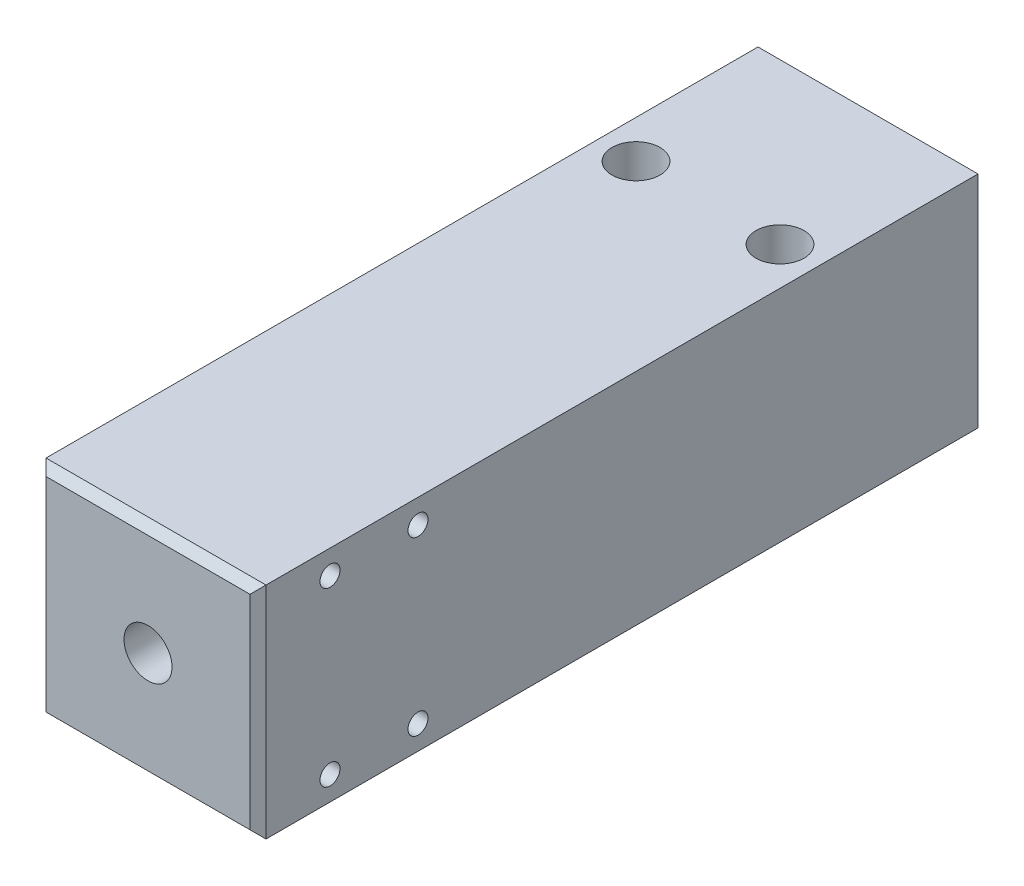
ISO-10303-21;
HEADER;
FILE_DESCRIPTION(('STEP AP214'),'2;1');
FILE_NAME('part.step','',(''),(''),'','','');
FILE_SCHEMA(('AUTOMOTIVE_DESIGN { 1 0 10303 214 1 1 1 1 }'));
ENDSEC;
DATA;
#1=APPLICATION_CONTEXT('core data for automotive mechanical design processes');
#2=APPLICATION_PROTOCOL_DEFINITION('international standard','automotive_design',2000,#1);
#3=PRODUCT_CONTEXT('',#1,'mechanical');
#4=PRODUCT('Part','Part','',(#3));
#5=PRODUCT_RELATED_PRODUCT_CATEGORY('part','',(#4));
#6=PRODUCT_DEFINITION_FORMATION('','',#4);
#7=PRODUCT_DEFINITION_CONTEXT('part definition',#1,'design');
#8=PRODUCT_DEFINITION('design','',#6,#7);
#9=PRODUCT_DEFINITION_SHAPE('','',#8);
#10=(LENGTH_UNIT() NAMED_UNIT(*) SI_UNIT(.MILLI.,.METRE.));
#11=(NAMED_UNIT(*) PLANE_ANGLE_UNIT() SI_UNIT($,.RADIAN.));
#12=(NAMED_UNIT(*) SI_UNIT($,.STERADIAN.) SOLID_ANGLE_UNIT());
#13=UNCERTAINTY_MEASURE_WITH_UNIT(LENGTH_MEASURE(1.E-05),#10,'distance_accuracy_value','');
#14=(GEOMETRIC_REPRESENTATION_CONTEXT(3) GLOBAL_UNCERTAINTY_ASSIGNED_CONTEXT((#13)) GLOBAL_UNIT_ASSIGNED_CONTEXT((#10,
#11,#12)) REPRESENTATION_CONTEXT('',''));
#15=CARTESIAN_POINT('',(0.,0.,0.));
#16=DIRECTION('',(0.,0.,1.));
#17=DIRECTION('',(1.,0.,0.));
#18=AXIS2_PLACEMENT_3D('',#15,#16,#17);
#19=CARTESIAN_POINT('',(27.5,27.5,-180.));
#20=DIRECTION('',(1.,0.,0.));
#21=DIRECTION('',(0.,1.,0.));
#22=AXIS2_PLACEMENT_3D('',#19,#20,#21);
#23=PLANE('',#22);
#24=CARTESIAN_POINT('',(27.5,-21.5,-18.));
#25=DIRECTION('',(1.,0.,0.));
#26=DIRECTION('',(0.,1.,0.));
#27=AXIS2_PLACEMENT_3D('',#24,#25,#26);
#28=CIRCLE('',#27,2.5);
#29=CARTESIAN_POINT('',(27.5,-19.,-18.));
#30=VERTEX_POINT('',#29);
#31=EDGE_CURVE('E187',#30,#30,#28,.T.);
#32=ORIENTED_EDGE('',*,*,#31,.F.);
#33=EDGE_LOOP('',(#32));
#34=FACE_BOUND('',#33,.T.);
#35=CARTESIAN_POINT('',(27.5,-21.5,-40.));
#36=DIRECTION('',(1.,0.,0.));
#37=DIRECTION('',(0.,1.,0.));
#38=AXIS2_PLACEMENT_3D('',#35,#36,#37);
#39=CIRCLE('',#38,2.5);
#40=CARTESIAN_POINT('',(27.5,-19.,-40.));
#41=VERTEX_POINT('',#40);
#42=EDGE_CURVE('E193',#41,#41,#39,.T.);
#43=ORIENTED_EDGE('',*,*,#42,.F.);
#44=EDGE_LOOP('',(#43));
#45=FACE_BOUND('',#44,.T.);
#46=CARTESIAN_POINT('',(27.5,21.5,-40.));
#47=DIRECTION('',(1.,0.,0.));
#48=DIRECTION('',(0.,1.,0.));
#49=AXIS2_PLACEMENT_3D('',#46,#47,#48);
#50=CIRCLE('',#49,2.5);
#51=CARTESIAN_POINT('',(27.5,24.,-40.));
#52=VERTEX_POINT('',#51);
#53=EDGE_CURVE('E199',#52,#52,#50,.T.);
#54=ORIENTED_EDGE('',*,*,#53,.F.);
#55=EDGE_LOOP('',(#54));
#56=FACE_BOUND('',#55,.T.);
#57=CARTESIAN_POINT('',(27.5,21.5,-18.));
#58=DIRECTION('',(1.,0.,0.));
#59=DIRECTION('',(0.,1.,0.));
#60=AXIS2_PLACEMENT_3D('',#57,#58,#59);
#61=CIRCLE('',#60,2.5);
#62=CARTESIAN_POINT('',(27.5,24.,-18.));
#63=VERTEX_POINT('',#62);
#64=EDGE_CURVE('E205',#63,#63,#61,.T.);
#65=ORIENTED_EDGE('',*,*,#64,.F.);
#66=EDGE_LOOP('',(#65));
#67=FACE_BOUND('',#66,.T.);
#68=DIRECTION('',(0.,0.,1.));
#69=VECTOR('',#68,1.);
#70=CARTESIAN_POINT('',(27.5,27.5,-180.));
#71=LINE('',#70,#69);
#72=CARTESIAN_POINT('',(27.5,27.5,-180.));
#73=VERTEX_POINT('',#72);
#74=CARTESIAN_POINT('',(27.5,27.5,-2.00000000000006));
#75=VERTEX_POINT('',#74);
#76=EDGE_CURVE('E89',#73,#75,#71,.T.);
#77=ORIENTED_EDGE('',*,*,#76,.T.);
#78=DIRECTION('',(0.,-1.,0.));
#79=VECTOR('',#78,1.);
#80=CARTESIAN_POINT('',(27.5,27.5,-2.));
#81=LINE('',#80,#79);
#82=CARTESIAN_POINT('',(27.5,-27.5,-2.00000000000006));
#83=VERTEX_POINT('',#82);
#84=EDGE_CURVE('E46',#75,#83,#81,.T.);
#85=ORIENTED_EDGE('',*,*,#84,.T.);
#86=DIRECTION('',(0.,0.,1.));
#87=VECTOR('',#86,1.);
#88=CARTESIAN_POINT('',(27.5,-27.5,-180.));
#89=LINE('',#88,#87);
#90=CARTESIAN_POINT('',(27.5,-27.5,-180.));
#91=VERTEX_POINT('',#90);
#92=EDGE_CURVE('E110',#91,#83,#89,.T.);
#93=ORIENTED_EDGE('',*,*,#92,.F.);
#94=DIRECTION('',(0.,1.,0.));
#95=VECTOR('',#94,1.);
#96=CARTESIAN_POINT('',(27.5,27.5,-180.));
#97=LINE('',#96,#95);
#98=EDGE_CURVE('E104',#91,#73,#97,.T.);
#99=ORIENTED_EDGE('',*,*,#98,.T.);
#100=EDGE_LOOP('',(#77,#85,#93,#99));
#101=FACE_BOUND('',#100,.T.);
#102=ADVANCED_FACE('F37',(#34,#45,#56,#67,#101),#23,.T.);
#103=CARTESIAN_POINT('',(-27.5,-27.5,-180.));
#104=DIRECTION('',(0.,-1.,0.));
#105=DIRECTION('',(0.,0.,-1.));
#106=AXIS2_PLACEMENT_3D('',#103,#104,#105);
#107=PLANE('',#106);
#108=ORIENTED_EDGE('',*,*,#92,.T.);
#109=DIRECTION('',(-1.,0.,0.));
#110=VECTOR('',#109,1.);
#111=CARTESIAN_POINT('',(-27.5,-27.5,-2.));
#112=LINE('',#111,#110);
#113=CARTESIAN_POINT('',(-27.5,-27.5,-2.00000000000006));
#114=VERTEX_POINT('',#113);
#115=EDGE_CURVE('E133',#83,#114,#112,.T.);
#116=ORIENTED_EDGE('',*,*,#115,.T.);
#117=DIRECTION('',(0.,0.,1.));
#118=VECTOR('',#117,1.);
#119=CARTESIAN_POINT('',(-27.5,-27.5,-180.));
#120=LINE('',#119,#118);
#121=CARTESIAN_POINT('',(-27.5,-27.5,-180.));
#122=VERTEX_POINT('',#121);
#123=EDGE_CURVE('E122',#122,#114,#120,.T.);
#124=ORIENTED_EDGE('',*,*,#123,.F.);
#125=DIRECTION('',(1.,0.,0.));
#126=VECTOR('',#125,1.);
#127=CARTESIAN_POINT('',(-27.5,-27.5,-180.));
#128=LINE('',#127,#126);
#129=EDGE_CURVE('E97',#122,#91,#128,.T.);
#130=ORIENTED_EDGE('',*,*,#129,.T.);
#131=EDGE_LOOP('',(#108,#116,#124,#130));
#132=FACE_BOUND('',#131,.T.);
#133=ADVANCED_FACE('F258',(#132),#107,.T.);
#134=CARTESIAN_POINT('',(-27.5,27.5,-180.));
#135=DIRECTION('',(-1.,0.,0.));
#136=DIRECTION('',(0.,-1.,0.));
#137=AXIS2_PLACEMENT_3D('',#134,#135,#136);
#138=PLANE('',#137);
#139=CARTESIAN_POINT('',(-27.5,-21.5,-18.));
#140=DIRECTION('',(-1.,0.,0.));
#141=DIRECTION('',(0.,-1.,0.));
#142=AXIS2_PLACEMENT_3D('',#139,#140,#141);
#143=CIRCLE('',#142,2.5);
#144=CARTESIAN_POINT('',(-27.5,-24.,-18.));
#145=VERTEX_POINT('',#144);
#146=EDGE_CURVE('E163',#145,#145,#143,.T.);
#147=ORIENTED_EDGE('',*,*,#146,.F.);
#148=EDGE_LOOP('',(#147));
#149=FACE_BOUND('',#148,.T.);
#150=CARTESIAN_POINT('',(-27.5,-21.5,-40.));
#151=DIRECTION('',(-1.,0.,0.));
#152=DIRECTION('',(0.,-1.,0.));
#153=AXIS2_PLACEMENT_3D('',#150,#151,#152);
#154=CIRCLE('',#153,2.5);
#155=CARTESIAN_POINT('',(-27.5,-24.,-40.));
#156=VERTEX_POINT('',#155);
#157=EDGE_CURVE('E169',#156,#156,#154,.T.);
#158=ORIENTED_EDGE('',*,*,#157,.F.);
#159=EDGE_LOOP('',(#158));
#160=FACE_BOUND('',#159,.T.);
#161=CARTESIAN_POINT('',(-27.5,21.5,-40.));
#162=DIRECTION('',(-1.,0.,0.));
#163=DIRECTION('',(0.,-1.,0.));
#164=AXIS2_PLACEMENT_3D('',#161,#162,#163);
#165=CIRCLE('',#164,2.5);
#166=CARTESIAN_POINT('',(-27.5,19.,-40.));
#167=VERTEX_POINT('',#166);
#168=EDGE_CURVE('E175',#167,#167,#165,.T.);
#169=ORIENTED_EDGE('',*,*,#168,.F.);
#170=EDGE_LOOP('',(#169));
#171=FACE_BOUND('',#170,.T.);
#172=CARTESIAN_POINT('',(-27.5,21.5,-18.));
#173=DIRECTION('',(-1.,0.,0.));
#174=DIRECTION('',(0.,-1.,0.));
#175=AXIS2_PLACEMENT_3D('',#172,#173,#174);
#176=CIRCLE('',#175,2.5);
#177=CARTESIAN_POINT('',(-27.5,19.,-18.));
#178=VERTEX_POINT('',#177);
#179=EDGE_CURVE('E181',#178,#178,#176,.T.);
#180=ORIENTED_EDGE('',*,*,#179,.F.);
#181=EDGE_LOOP('',(#180));
#182=FACE_BOUND('',#181,.T.);
#183=ORIENTED_EDGE('',*,*,#123,.T.);
#184=DIRECTION('',(0.,1.,0.));
#185=VECTOR('',#184,1.);
#186=CARTESIAN_POINT('',(-27.5,27.5,-2.));
#187=LINE('',#186,#185);
#188=CARTESIAN_POINT('',(-27.5,27.5,-2.00000000000006));
#189=VERTEX_POINT('',#188);
#190=EDGE_CURVE('E60',#114,#189,#187,.T.);
#191=ORIENTED_EDGE('',*,*,#190,.T.);
#192=DIRECTION('',(0.,0.,1.));
#193=VECTOR('',#192,1.);
#194=CARTESIAN_POINT('',(-27.5,27.5,-180.));
#195=LINE('',#194,#193);
#196=CARTESIAN_POINT('',(-27.5,27.5,-180.));
#197=VERTEX_POINT('',#196);
#198=EDGE_CURVE('E96',#197,#189,#195,.T.);
#199=ORIENTED_EDGE('',*,*,#198,.F.);
#200=DIRECTION('',(0.,-1.,0.));
#201=VECTOR('',#200,1.);
#202=CARTESIAN_POINT('',(-27.5,27.5,-180.));
#203=LINE('',#202,#201);
#204=EDGE_CURVE('E107',#197,#122,#203,.T.);
#205=ORIENTED_EDGE('',*,*,#204,.T.);
#206=EDGE_LOOP('',(#183,#191,#199,#205));
#207=FACE_BOUND('',#206,.T.);
#208=ADVANCED_FACE('F251',(#149,#160,#171,#182,#207),#138,.T.);
#209=CARTESIAN_POINT('',(-27.5,27.5,-180.));
#210=DIRECTION('',(0.,1.,0.));
#211=DIRECTION('',(0.,0.,1.));
#212=AXIS2_PLACEMENT_3D('',#209,#210,#211);
#213=PLANE('',#212);
#214=CARTESIAN_POINT('',(18.,27.5,-140.));
#215=DIRECTION('',(0.,1.,0.));
#216=DIRECTION('',(0.,0.,1.));
#217=AXIS2_PLACEMENT_3D('',#214,#215,#216);
#218=CIRCLE('',#217,6.);
#219=CARTESIAN_POINT('',(18.,27.5,-134.));
#220=VERTEX_POINT('',#219);
#221=EDGE_CURVE('E147',#220,#220,#218,.T.);
#222=ORIENTED_EDGE('',*,*,#221,.F.);
#223=EDGE_LOOP('',(#222));
#224=FACE_BOUND('',#223,.T.);
#225=CARTESIAN_POINT('',(-18.,27.5,-140.));
#226=DIRECTION('',(0.,1.,0.));
#227=DIRECTION('',(0.,0.,1.));
#228=AXIS2_PLACEMENT_3D('',#225,#226,#227);
#229=CIRCLE('',#228,6.);
#230=CARTESIAN_POINT('',(-18.,27.5,-134.));
#231=VERTEX_POINT('',#230);
#232=EDGE_CURVE('E157',#231,#231,#229,.T.);
#233=ORIENTED_EDGE('',*,*,#232,.F.);
#234=EDGE_LOOP('',(#233));
#235=FACE_BOUND('',#234,.T.);
#236=ORIENTED_EDGE('',*,*,#198,.T.);
#237=DIRECTION('',(1.,0.,0.));
#238=VECTOR('',#237,1.);
#239=CARTESIAN_POINT('',(-27.5,27.5,-2.));
#240=LINE('',#239,#238);
#241=EDGE_CURVE('E11',#189,#75,#240,.T.);
#242=ORIENTED_EDGE('',*,*,#241,.T.);
#243=ORIENTED_EDGE('',*,*,#76,.F.);
#244=DIRECTION('',(-1.,0.,0.));
#245=VECTOR('',#244,1.);
#246=CARTESIAN_POINT('',(-27.5,27.5,-180.));
#247=LINE('',#246,#245);
#248=EDGE_CURVE('E92',#73,#197,#247,.T.);
#249=ORIENTED_EDGE('',*,*,#248,.T.);
#250=EDGE_LOOP('',(#236,#242,#243,#249));
#251=FACE_BOUND('',#250,.T.);
#252=ADVANCED_FACE('F91',(#224,#235,#251),#213,.T.);
#253=CARTESIAN_POINT('',(0.,0.,-180.));
#254=DIRECTION('',(0.,0.,1.));
#255=DIRECTION('',(1.,0.,0.));
#256=AXIS2_PLACEMENT_3D('',#253,#254,#255);
#257=PLANE('',#256);
#258=CARTESIAN_POINT('',(-18.,-18.,-180.));
#259=DIRECTION('',(0.,0.,-1.));
#260=DIRECTION('',(-1.,0.,0.));
#261=AXIS2_PLACEMENT_3D('',#258,#259,#260);
#262=CIRCLE('',#261,4.);
#263=CARTESIAN_POINT('',(-22.,-18.,-180.));
#264=VERTEX_POINT('',#263);
#265=EDGE_CURVE('E211',#264,#264,#262,.T.);
#266=ORIENTED_EDGE('',*,*,#265,.F.);
#267=EDGE_LOOP('',(#266));
#268=FACE_BOUND('',#267,.T.);
#269=CARTESIAN_POINT('',(18.,-18.,-180.));
#270=DIRECTION('',(0.,0.,-1.));
#271=DIRECTION('',(-1.,0.,0.));
#272=AXIS2_PLACEMENT_3D('',#269,#270,#271);
#273=CIRCLE('',#272,4.);
#274=CARTESIAN_POINT('',(14.,-18.,-180.));
#275=VERTEX_POINT('',#274);
#276=EDGE_CURVE('E217',#275,#275,#273,.T.);
#277=ORIENTED_EDGE('',*,*,#276,.F.);
#278=EDGE_LOOP('',(#277));
#279=FACE_BOUND('',#278,.T.);
#280=CARTESIAN_POINT('',(18.,18.,-180.));
#281=DIRECTION('',(0.,0.,-1.));
#282=DIRECTION('',(-1.,0.,0.));
#283=AXIS2_PLACEMENT_3D('',#280,#281,#282);
#284=CIRCLE('',#283,4.);
#285=CARTESIAN_POINT('',(14.,18.,-180.));
#286=VERTEX_POINT('',#285);
#287=EDGE_CURVE('E223',#286,#286,#284,.T.);
#288=ORIENTED_EDGE('',*,*,#287,.F.);
#289=EDGE_LOOP('',(#288));
#290=FACE_BOUND('',#289,.T.);
#291=CARTESIAN_POINT('',(-18.,18.,-180.));
#292=DIRECTION('',(0.,0.,-1.));
#293=DIRECTION('',(-1.,0.,0.));
#294=AXIS2_PLACEMENT_3D('',#291,#292,#293);
#295=CIRCLE('',#294,4.);
#296=CARTESIAN_POINT('',(-22.,18.,-180.));
#297=VERTEX_POINT('',#296);
#298=EDGE_CURVE('E229',#297,#297,#295,.T.);
#299=ORIENTED_EDGE('',*,*,#298,.F.);
#300=EDGE_LOOP('',(#299));
#301=FACE_BOUND('',#300,.T.);
#302=ORIENTED_EDGE('',*,*,#98,.F.);
#303=ORIENTED_EDGE('',*,*,#129,.F.);
#304=ORIENTED_EDGE('',*,*,#204,.F.);
#305=ORIENTED_EDGE('',*,*,#248,.F.);
#306=EDGE_LOOP('',(#302,#303,#304,#305));
#307=FACE_BOUND('',#306,.T.);
#308=ADVANCED_FACE('F102',(#268,#279,#290,#301,#307),#257,.F.);
#309=CARTESIAN_POINT('',(0.,0.,0.));
#310=DIRECTION('',(0.,0.,1.));
#311=DIRECTION('',(1.,0.,0.));
#312=AXIS2_PLACEMENT_3D('',#309,#310,#311);
#313=PLANE('',#312);
#314=DIRECTION('',(0.,-1.,0.));
#315=VECTOR('',#314,1.);
#316=CARTESIAN_POINT('',(-25.5,0.,0.));
#317=LINE('',#316,#315);
#318=CARTESIAN_POINT('',(-25.5,25.5,0.));
#319=VERTEX_POINT('',#318);
#320=CARTESIAN_POINT('',(-25.5,-25.5,0.));
#321=VERTEX_POINT('',#320);
#322=EDGE_CURVE('E128',#319,#321,#317,.T.);
#323=ORIENTED_EDGE('',*,*,#322,.T.);
#324=DIRECTION('',(1.,0.,0.));
#325=VECTOR('',#324,1.);
#326=CARTESIAN_POINT('',(0.,-25.5,0.));
#327=LINE('',#326,#325);
#328=CARTESIAN_POINT('',(25.5,-25.5,0.));
#329=VERTEX_POINT('',#328);
#330=EDGE_CURVE('E130',#321,#329,#327,.T.);
#331=ORIENTED_EDGE('',*,*,#330,.T.);
#332=DIRECTION('',(0.,1.,0.));
#333=VECTOR('',#332,1.);
#334=CARTESIAN_POINT('',(25.5,0.,0.));
#335=LINE('',#334,#333);
#336=CARTESIAN_POINT('',(25.5,25.5,0.));
#337=VERTEX_POINT('',#336);
#338=EDGE_CURVE('E126',#329,#337,#335,.T.);
#339=ORIENTED_EDGE('',*,*,#338,.T.);
#340=DIRECTION('',(-1.,0.,0.));
#341=VECTOR('',#340,1.);
#342=CARTESIAN_POINT('',(0.,25.5,0.));
#343=LINE('',#342,#341);
#344=EDGE_CURVE('E121',#337,#319,#343,.T.);
#345=ORIENTED_EDGE('',*,*,#344,.T.);
#346=EDGE_LOOP('',(#323,#331,#339,#345));
#347=FACE_BOUND('',#346,.T.);
#348=CARTESIAN_POINT('',(0.,0.,0.));
#349=DIRECTION('',(0.,0.,1.));
#350=DIRECTION('',(1.,0.,0.));
#351=AXIS2_PLACEMENT_3D('',#348,#349,#350);
#352=CIRCLE('',#351,6.);
#353=CARTESIAN_POINT('',(6.,0.,0.));
#354=VERTEX_POINT('',#353);
#355=EDGE_CURVE('E114',#354,#354,#352,.T.);
#356=ORIENTED_EDGE('',*,*,#355,.F.);
#357=EDGE_LOOP('',(#356));
#358=FACE_BOUND('',#357,.T.);
#359=ADVANCED_FACE('F241',(#347,#358),#313,.T.);
#360=CARTESIAN_POINT('',(0.,0.,-30.));
#361=DIRECTION('',(0.,0.,1.));
#362=DIRECTION('',(1.,0.,0.));
#363=AXIS2_PLACEMENT_3D('',#360,#361,#362);
#364=CYLINDRICAL_SURFACE('',#363,6.);
#365=CARTESIAN_POINT('',(0.,0.,-30.));
#366=DIRECTION('',(0.,0.,1.));
#367=DIRECTION('',(1.,0.,0.));
#368=AXIS2_PLACEMENT_3D('',#365,#366,#367);
#369=CIRCLE('',#368,6.);
#370=CARTESIAN_POINT('',(6.,0.,-30.));
#371=VERTEX_POINT('',#370);
#372=EDGE_CURVE('E111',#371,#371,#369,.T.);
#373=ORIENTED_EDGE('',*,*,#372,.F.);
#374=EDGE_LOOP('',(#373));
#375=FACE_BOUND('',#374,.T.);
#376=ORIENTED_EDGE('',*,*,#355,.T.);
#377=EDGE_LOOP('',(#376));
#378=FACE_BOUND('',#377,.T.);
#379=ADVANCED_FACE('F248',(#375,#378),#364,.F.);
#380=CARTESIAN_POINT('',(0.,0.,-30.));
#381=DIRECTION('',(0.,0.,1.));
#382=DIRECTION('',(1.,0.,0.));
#383=AXIS2_PLACEMENT_3D('',#380,#381,#382);
#384=PLANE('',#383);
#385=ORIENTED_EDGE('',*,*,#372,.T.);
#386=EDGE_LOOP('',(#385));
#387=FACE_BOUND('',#386,.T.);
#388=ADVANCED_FACE('F299',(#387),#384,.T.);
#389=CARTESIAN_POINT('',(-18.,18.,-155.));
#390=DIRECTION('',(0.,0.,-1.));
#391=DIRECTION('',(-1.,0.,0.));
#392=AXIS2_PLACEMENT_3D('',#389,#390,#391);
#393=CYLINDRICAL_SURFACE('',#392,4.);
#394=CARTESIAN_POINT('',(-18.,18.,-155.));
#395=DIRECTION('',(0.,0.,-1.));
#396=DIRECTION('',(-1.,0.,0.));
#397=AXIS2_PLACEMENT_3D('',#394,#395,#396);
#398=CIRCLE('',#397,4.);
#399=CARTESIAN_POINT('',(-22.,18.,-155.));
#400=VERTEX_POINT('',#399);
#401=EDGE_CURVE('E232',#400,#400,#398,.T.);
#402=ORIENTED_EDGE('',*,*,#401,.F.);
#403=EDGE_LOOP('',(#402));
#404=FACE_BOUND('',#403,.T.);
#405=ORIENTED_EDGE('',*,*,#298,.T.);
#406=EDGE_LOOP('',(#405));
#407=FACE_BOUND('',#406,.T.);
#408=ADVANCED_FACE('F238',(#404,#407),#393,.F.);
#409=CARTESIAN_POINT('',(-18.,18.,-155.));
#410=DIRECTION('',(0.,0.,-1.));
#411=DIRECTION('',(-1.,0.,0.));
#412=AXIS2_PLACEMENT_3D('',#409,#410,#411);
#413=PLANE('',#412);
#414=ORIENTED_EDGE('',*,*,#401,.T.);
#415=EDGE_LOOP('',(#414));
#416=FACE_BOUND('',#415,.T.);
#417=ADVANCED_FACE('F310',(#416),#413,.T.);
#418=CARTESIAN_POINT('',(18.,18.,-155.));
#419=DIRECTION('',(0.,0.,-1.));
#420=DIRECTION('',(-1.,0.,0.));
#421=AXIS2_PLACEMENT_3D('',#418,#419,#420);
#422=CYLINDRICAL_SURFACE('',#421,4.);
#423=CARTESIAN_POINT('',(18.,18.,-155.));
#424=DIRECTION('',(0.,0.,-1.));
#425=DIRECTION('',(-1.,0.,0.));
#426=AXIS2_PLACEMENT_3D('',#423,#424,#425);
#427=CIRCLE('',#426,4.);
#428=CARTESIAN_POINT('',(14.,18.,-155.));
#429=VERTEX_POINT('',#428);
#430=EDGE_CURVE('E226',#429,#429,#427,.T.);
#431=ORIENTED_EDGE('',*,*,#430,.F.);
#432=EDGE_LOOP('',(#431));
#433=FACE_BOUND('',#432,.T.);
#434=ORIENTED_EDGE('',*,*,#287,.T.);
#435=EDGE_LOOP('',(#434));
#436=FACE_BOUND('',#435,.T.);
#437=ADVANCED_FACE('F314',(#433,#436),#422,.F.);
#438=CARTESIAN_POINT('',(18.,18.,-155.));
#439=DIRECTION('',(0.,0.,-1.));
#440=DIRECTION('',(-1.,0.,0.));
#441=AXIS2_PLACEMENT_3D('',#438,#439,#440);
#442=PLANE('',#441);
#443=ORIENTED_EDGE('',*,*,#430,.T.);
#444=EDGE_LOOP('',(#443));
#445=FACE_BOUND('',#444,.T.);
#446=ADVANCED_FACE('F318',(#445),#442,.T.);
#447=CARTESIAN_POINT('',(18.,-18.,-155.));
#448=DIRECTION('',(0.,0.,-1.));
#449=DIRECTION('',(-1.,0.,0.));
#450=AXIS2_PLACEMENT_3D('',#447,#448,#449);
#451=CYLINDRICAL_SURFACE('',#450,4.);
#452=CARTESIAN_POINT('',(18.,-18.,-155.));
#453=DIRECTION('',(0.,0.,-1.));
#454=DIRECTION('',(-1.,0.,0.));
#455=AXIS2_PLACEMENT_3D('',#452,#453,#454);
#456=CIRCLE('',#455,4.);
#457=CARTESIAN_POINT('',(14.,-18.,-155.));
#458=VERTEX_POINT('',#457);
#459=EDGE_CURVE('E220',#458,#458,#456,.T.);
#460=ORIENTED_EDGE('',*,*,#459,.F.);
#461=EDGE_LOOP('',(#460));
#462=FACE_BOUND('',#461,.T.);
#463=ORIENTED_EDGE('',*,*,#276,.T.);
#464=EDGE_LOOP('',(#463));
#465=FACE_BOUND('',#464,.T.);
#466=ADVANCED_FACE('F322',(#462,#465),#451,.F.);
#467=CARTESIAN_POINT('',(18.,-18.,-155.));
#468=DIRECTION('',(0.,0.,-1.));
#469=DIRECTION('',(-1.,0.,0.));
#470=AXIS2_PLACEMENT_3D('',#467,#468,#469);
#471=PLANE('',#470);
#472=ORIENTED_EDGE('',*,*,#459,.T.);
#473=EDGE_LOOP('',(#472));
#474=FACE_BOUND('',#473,.T.);
#475=ADVANCED_FACE('F326',(#474),#471,.T.);
#476=CARTESIAN_POINT('',(-18.,-18.,-155.));
#477=DIRECTION('',(0.,0.,-1.));
#478=DIRECTION('',(-1.,0.,0.));
#479=AXIS2_PLACEMENT_3D('',#476,#477,#478);
#480=CYLINDRICAL_SURFACE('',#479,4.);
#481=CARTESIAN_POINT('',(-18.,-18.,-155.));
#482=DIRECTION('',(0.,0.,-1.));
#483=DIRECTION('',(-1.,0.,0.));
#484=AXIS2_PLACEMENT_3D('',#481,#482,#483);
#485=CIRCLE('',#484,4.);
#486=CARTESIAN_POINT('',(-22.,-18.,-155.));
#487=VERTEX_POINT('',#486);
#488=EDGE_CURVE('E214',#487,#487,#485,.T.);
#489=ORIENTED_EDGE('',*,*,#488,.F.);
#490=EDGE_LOOP('',(#489));
#491=FACE_BOUND('',#490,.T.);
#492=ORIENTED_EDGE('',*,*,#265,.T.);
#493=EDGE_LOOP('',(#492));
#494=FACE_BOUND('',#493,.T.);
#495=ADVANCED_FACE('F330',(#491,#494),#480,.F.);
#496=CARTESIAN_POINT('',(-18.,-18.,-155.));
#497=DIRECTION('',(0.,0.,-1.));
#498=DIRECTION('',(-1.,0.,0.));
#499=AXIS2_PLACEMENT_3D('',#496,#497,#498);
#500=PLANE('',#499);
#501=ORIENTED_EDGE('',*,*,#488,.T.);
#502=EDGE_LOOP('',(#501));
#503=FACE_BOUND('',#502,.T.);
#504=ADVANCED_FACE('F334',(#503),#500,.T.);
#505=CARTESIAN_POINT('',(12.5,21.5,-18.));
#506=DIRECTION('',(1.,0.,0.));
#507=DIRECTION('',(0.,1.,0.));
#508=AXIS2_PLACEMENT_3D('',#505,#506,#507);
#509=CYLINDRICAL_SURFACE('',#508,2.5);
#510=CARTESIAN_POINT('',(12.5,21.5,-18.));
#511=DIRECTION('',(1.,0.,0.));
#512=DIRECTION('',(0.,1.,0.));
#513=AXIS2_PLACEMENT_3D('',#510,#511,#512);
#514=CIRCLE('',#513,2.5);
#515=CARTESIAN_POINT('',(12.5,24.,-18.));
#516=VERTEX_POINT('',#515);
#517=EDGE_CURVE('E208',#516,#516,#514,.T.);
#518=ORIENTED_EDGE('',*,*,#517,.F.);
#519=EDGE_LOOP('',(#518));
#520=FACE_BOUND('',#519,.T.);
#521=ORIENTED_EDGE('',*,*,#64,.T.);
#522=EDGE_LOOP('',(#521));
#523=FACE_BOUND('',#522,.T.);
#524=ADVANCED_FACE('F338',(#520,#523),#509,.F.);
#525=CARTESIAN_POINT('',(12.5,21.5,-18.));
#526=DIRECTION('',(1.,0.,0.));
#527=DIRECTION('',(0.,1.,0.));
#528=AXIS2_PLACEMENT_3D('',#525,#526,#527);
#529=PLANE('',#528);
#530=ORIENTED_EDGE('',*,*,#517,.T.);
#531=EDGE_LOOP('',(#530));
#532=FACE_BOUND('',#531,.T.);
#533=ADVANCED_FACE('F342',(#532),#529,.T.);
#534=CARTESIAN_POINT('',(12.5,21.5,-40.));
#535=DIRECTION('',(1.,0.,0.));
#536=DIRECTION('',(0.,1.,0.));
#537=AXIS2_PLACEMENT_3D('',#534,#535,#536);
#538=CYLINDRICAL_SURFACE('',#537,2.5);
#539=CARTESIAN_POINT('',(12.5,21.5,-40.));
#540=DIRECTION('',(1.,0.,0.));
#541=DIRECTION('',(0.,1.,0.));
#542=AXIS2_PLACEMENT_3D('',#539,#540,#541);
#543=CIRCLE('',#542,2.5);
#544=CARTESIAN_POINT('',(12.5,24.,-40.));
#545=VERTEX_POINT('',#544);
#546=EDGE_CURVE('E202',#545,#545,#543,.T.);
#547=ORIENTED_EDGE('',*,*,#546,.F.);
#548=EDGE_LOOP('',(#547));
#549=FACE_BOUND('',#548,.T.);
#550=ORIENTED_EDGE('',*,*,#53,.T.);
#551=EDGE_LOOP('',(#550));
#552=FACE_BOUND('',#551,.T.);
#553=ADVANCED_FACE('F346',(#549,#552),#538,.F.);
#554=CARTESIAN_POINT('',(12.5,21.5,-40.));
#555=DIRECTION('',(1.,0.,0.));
#556=DIRECTION('',(0.,1.,0.));
#557=AXIS2_PLACEMENT_3D('',#554,#555,#556);
#558=PLANE('',#557);
#559=ORIENTED_EDGE('',*,*,#546,.T.);
#560=EDGE_LOOP('',(#559));
#561=FACE_BOUND('',#560,.T.);
#562=ADVANCED_FACE('F350',(#561),#558,.T.);
#563=CARTESIAN_POINT('',(12.5,-21.5,-40.));
#564=DIRECTION('',(1.,0.,0.));
#565=DIRECTION('',(0.,1.,0.));
#566=AXIS2_PLACEMENT_3D('',#563,#564,#565);
#567=CYLINDRICAL_SURFACE('',#566,2.5);
#568=CARTESIAN_POINT('',(12.5,-21.5,-40.));
#569=DIRECTION('',(1.,0.,0.));
#570=DIRECTION('',(0.,1.,0.));
#571=AXIS2_PLACEMENT_3D('',#568,#569,#570);
#572=CIRCLE('',#571,2.5);
#573=CARTESIAN_POINT('',(12.5,-19.,-40.));
#574=VERTEX_POINT('',#573);
#575=EDGE_CURVE('E196',#574,#574,#572,.T.);
#576=ORIENTED_EDGE('',*,*,#575,.F.);
#577=EDGE_LOOP('',(#576));
#578=FACE_BOUND('',#577,.T.);
#579=ORIENTED_EDGE('',*,*,#42,.T.);
#580=EDGE_LOOP('',(#579));
#581=FACE_BOUND('',#580,.T.);
#582=ADVANCED_FACE('F354',(#578,#581),#567,.F.);
#583=CARTESIAN_POINT('',(12.5,-21.5,-40.));
#584=DIRECTION('',(1.,0.,0.));
#585=DIRECTION('',(0.,1.,0.));
#586=AXIS2_PLACEMENT_3D('',#583,#584,#585);
#587=PLANE('',#586);
#588=ORIENTED_EDGE('',*,*,#575,.T.);
#589=EDGE_LOOP('',(#588));
#590=FACE_BOUND('',#589,.T.);
#591=ADVANCED_FACE('F358',(#590),#587,.T.);
#592=CARTESIAN_POINT('',(12.5,-21.5,-18.));
#593=DIRECTION('',(1.,0.,0.));
#594=DIRECTION('',(0.,1.,0.));
#595=AXIS2_PLACEMENT_3D('',#592,#593,#594);
#596=CYLINDRICAL_SURFACE('',#595,2.5);
#597=CARTESIAN_POINT('',(12.5,-21.5,-18.));
#598=DIRECTION('',(1.,0.,0.));
#599=DIRECTION('',(0.,1.,0.));
#600=AXIS2_PLACEMENT_3D('',#597,#598,#599);
#601=CIRCLE('',#600,2.5);
#602=CARTESIAN_POINT('',(12.5,-19.,-18.));
#603=VERTEX_POINT('',#602);
#604=EDGE_CURVE('E190',#603,#603,#601,.T.);
#605=ORIENTED_EDGE('',*,*,#604,.F.);
#606=EDGE_LOOP('',(#605));
#607=FACE_BOUND('',#606,.T.);
#608=ORIENTED_EDGE('',*,*,#31,.T.);
#609=EDGE_LOOP('',(#608));
#610=FACE_BOUND('',#609,.T.);
#611=ADVANCED_FACE('F362',(#607,#610),#596,.F.);
#612=CARTESIAN_POINT('',(12.5,-21.5,-18.));
#613=DIRECTION('',(1.,0.,0.));
#614=DIRECTION('',(0.,1.,0.));
#615=AXIS2_PLACEMENT_3D('',#612,#613,#614);
#616=PLANE('',#615);
#617=ORIENTED_EDGE('',*,*,#604,.T.);
#618=EDGE_LOOP('',(#617));
#619=FACE_BOUND('',#618,.T.);
#620=ADVANCED_FACE('F366',(#619),#616,.T.);
#621=CARTESIAN_POINT('',(-12.5,21.5,-18.));
#622=DIRECTION('',(-1.,0.,0.));
#623=DIRECTION('',(0.,-1.,0.));
#624=AXIS2_PLACEMENT_3D('',#621,#622,#623);
#625=CYLINDRICAL_SURFACE('',#624,2.5);
#626=CARTESIAN_POINT('',(-12.5,21.5,-18.));
#627=DIRECTION('',(-1.,0.,0.));
#628=DIRECTION('',(0.,-1.,0.));
#629=AXIS2_PLACEMENT_3D('',#626,#627,#628);
#630=CIRCLE('',#629,2.5);
#631=CARTESIAN_POINT('',(-12.5,19.,-18.));
#632=VERTEX_POINT('',#631);
#633=EDGE_CURVE('E184',#632,#632,#630,.T.);
#634=ORIENTED_EDGE('',*,*,#633,.F.);
#635=EDGE_LOOP('',(#634));
#636=FACE_BOUND('',#635,.T.);
#637=ORIENTED_EDGE('',*,*,#179,.T.);
#638=EDGE_LOOP('',(#637));
#639=FACE_BOUND('',#638,.T.);
#640=ADVANCED_FACE('F370',(#636,#639),#625,.F.);
#641=CARTESIAN_POINT('',(-12.5,21.5,-18.));
#642=DIRECTION('',(-1.,0.,0.));
#643=DIRECTION('',(0.,-1.,0.));
#644=AXIS2_PLACEMENT_3D('',#641,#642,#643);
#645=PLANE('',#644);
#646=ORIENTED_EDGE('',*,*,#633,.T.);
#647=EDGE_LOOP('',(#646));
#648=FACE_BOUND('',#647,.T.);
#649=ADVANCED_FACE('F374',(#648),#645,.T.);
#650=CARTESIAN_POINT('',(-12.5,21.5,-40.));
#651=DIRECTION('',(-1.,0.,0.));
#652=DIRECTION('',(0.,-1.,0.));
#653=AXIS2_PLACEMENT_3D('',#650,#651,#652);
#654=CYLINDRICAL_SURFACE('',#653,2.5);
#655=CARTESIAN_POINT('',(-12.5,21.5,-40.));
#656=DIRECTION('',(-1.,0.,0.));
#657=DIRECTION('',(0.,-1.,0.));
#658=AXIS2_PLACEMENT_3D('',#655,#656,#657);
#659=CIRCLE('',#658,2.5);
#660=CARTESIAN_POINT('',(-12.5,19.,-40.));
#661=VERTEX_POINT('',#660);
#662=EDGE_CURVE('E178',#661,#661,#659,.T.);
#663=ORIENTED_EDGE('',*,*,#662,.F.);
#664=EDGE_LOOP('',(#663));
#665=FACE_BOUND('',#664,.T.);
#666=ORIENTED_EDGE('',*,*,#168,.T.);
#667=EDGE_LOOP('',(#666));
#668=FACE_BOUND('',#667,.T.);
#669=ADVANCED_FACE('F378',(#665,#668),#654,.F.);
#670=CARTESIAN_POINT('',(-12.5,21.5,-40.));
#671=DIRECTION('',(-1.,0.,0.));
#672=DIRECTION('',(0.,-1.,0.));
#673=AXIS2_PLACEMENT_3D('',#670,#671,#672);
#674=PLANE('',#673);
#675=ORIENTED_EDGE('',*,*,#662,.T.);
#676=EDGE_LOOP('',(#675));
#677=FACE_BOUND('',#676,.T.);
#678=ADVANCED_FACE('F382',(#677),#674,.T.);
#679=CARTESIAN_POINT('',(-12.5,-21.5,-40.));
#680=DIRECTION('',(-1.,0.,0.));
#681=DIRECTION('',(0.,-1.,0.));
#682=AXIS2_PLACEMENT_3D('',#679,#680,#681);
#683=CYLINDRICAL_SURFACE('',#682,2.5);
#684=CARTESIAN_POINT('',(-12.5,-21.5,-40.));
#685=DIRECTION('',(-1.,0.,0.));
#686=DIRECTION('',(0.,-1.,0.));
#687=AXIS2_PLACEMENT_3D('',#684,#685,#686);
#688=CIRCLE('',#687,2.5);
#689=CARTESIAN_POINT('',(-12.5,-24.,-40.));
#690=VERTEX_POINT('',#689);
#691=EDGE_CURVE('E172',#690,#690,#688,.T.);
#692=ORIENTED_EDGE('',*,*,#691,.F.);
#693=EDGE_LOOP('',(#692));
#694=FACE_BOUND('',#693,.T.);
#695=ORIENTED_EDGE('',*,*,#157,.T.);
#696=EDGE_LOOP('',(#695));
#697=FACE_BOUND('',#696,.T.);
#698=ADVANCED_FACE('F386',(#694,#697),#683,.F.);
#699=CARTESIAN_POINT('',(-12.5,-21.5,-40.));
#700=DIRECTION('',(-1.,0.,0.));
#701=DIRECTION('',(0.,-1.,0.));
#702=AXIS2_PLACEMENT_3D('',#699,#700,#701);
#703=PLANE('',#702);
#704=ORIENTED_EDGE('',*,*,#691,.T.);
#705=EDGE_LOOP('',(#704));
#706=FACE_BOUND('',#705,.T.);
#707=ADVANCED_FACE('F390',(#706),#703,.T.);
#708=CARTESIAN_POINT('',(-12.5,-21.5,-18.));
#709=DIRECTION('',(-1.,0.,0.));
#710=DIRECTION('',(0.,-1.,0.));
#711=AXIS2_PLACEMENT_3D('',#708,#709,#710);
#712=CYLINDRICAL_SURFACE('',#711,2.5);
#713=CARTESIAN_POINT('',(-12.5,-21.5,-18.));
#714=DIRECTION('',(-1.,0.,0.));
#715=DIRECTION('',(0.,-1.,0.));
#716=AXIS2_PLACEMENT_3D('',#713,#714,#715);
#717=CIRCLE('',#716,2.5);
#718=CARTESIAN_POINT('',(-12.5,-24.,-18.));
#719=VERTEX_POINT('',#718);
#720=EDGE_CURVE('E166',#719,#719,#717,.T.);
#721=ORIENTED_EDGE('',*,*,#720,.F.);
#722=EDGE_LOOP('',(#721));
#723=FACE_BOUND('',#722,.T.);
#724=ORIENTED_EDGE('',*,*,#146,.T.);
#725=EDGE_LOOP('',(#724));
#726=FACE_BOUND('',#725,.T.);
#727=ADVANCED_FACE('F394',(#723,#726),#712,.F.);
#728=CARTESIAN_POINT('',(-12.5,-21.5,-18.));
#729=DIRECTION('',(-1.,0.,0.));
#730=DIRECTION('',(0.,-1.,0.));
#731=AXIS2_PLACEMENT_3D('',#728,#729,#730);
#732=PLANE('',#731);
#733=ORIENTED_EDGE('',*,*,#720,.T.);
#734=EDGE_LOOP('',(#733));
#735=FACE_BOUND('',#734,.T.);
#736=ADVANCED_FACE('F398',(#735),#732,.T.);
#737=CARTESIAN_POINT('',(-18.,15.5,-140.));
#738=DIRECTION('',(0.,1.,0.));
#739=DIRECTION('',(0.,0.,1.));
#740=AXIS2_PLACEMENT_3D('',#737,#738,#739);
#741=CYLINDRICAL_SURFACE('',#740,6.);
#742=CARTESIAN_POINT('',(-18.,15.5,-140.));
#743=DIRECTION('',(0.,1.,0.));
#744=DIRECTION('',(0.,0.,1.));
#745=AXIS2_PLACEMENT_3D('',#742,#743,#744);
#746=CIRCLE('',#745,6.);
#747=CARTESIAN_POINT('',(-18.,15.5,-134.));
#748=VERTEX_POINT('',#747);
#749=EDGE_CURVE('E160',#748,#748,#746,.T.);
#750=ORIENTED_EDGE('',*,*,#749,.F.);
#751=EDGE_LOOP('',(#750));
#752=FACE_BOUND('',#751,.T.);
#753=ORIENTED_EDGE('',*,*,#232,.T.);
#754=EDGE_LOOP('',(#753));
#755=FACE_BOUND('',#754,.T.);
#756=ADVANCED_FACE('F402',(#752,#755),#741,.F.);
#757=CARTESIAN_POINT('',(-18.,15.5,-140.));
#758=DIRECTION('',(0.,1.,0.));
#759=DIRECTION('',(0.,0.,1.));
#760=AXIS2_PLACEMENT_3D('',#757,#758,#759);
#761=PLANE('',#760);
#762=ORIENTED_EDGE('',*,*,#749,.T.);
#763=EDGE_LOOP('',(#762));
#764=FACE_BOUND('',#763,.T.);
#765=ADVANCED_FACE('F406',(#764),#761,.T.);
#766=CARTESIAN_POINT('',(18.,15.5,-140.));
#767=DIRECTION('',(0.,1.,0.));
#768=DIRECTION('',(0.,0.,1.));
#769=AXIS2_PLACEMENT_3D('',#766,#767,#768);
#770=CYLINDRICAL_SURFACE('',#769,6.);
#771=CARTESIAN_POINT('',(18.,15.5,-140.));
#772=DIRECTION('',(0.,1.,0.));
#773=DIRECTION('',(0.,0.,1.));
#774=AXIS2_PLACEMENT_3D('',#771,#772,#773);
#775=CIRCLE('',#774,6.);
#776=CARTESIAN_POINT('',(18.,15.5,-134.));
#777=VERTEX_POINT('',#776);
#778=EDGE_CURVE('E152',#777,#777,#775,.T.);
#779=ORIENTED_EDGE('',*,*,#778,.F.);
#780=EDGE_LOOP('',(#779));
#781=FACE_BOUND('',#780,.T.);
#782=ORIENTED_EDGE('',*,*,#221,.T.);
#783=EDGE_LOOP('',(#782));
#784=FACE_BOUND('',#783,.T.);
#785=ADVANCED_FACE('F286',(#781,#784),#770,.F.);
#786=CARTESIAN_POINT('',(18.,15.5,-140.));
#787=DIRECTION('',(0.,1.,0.));
#788=DIRECTION('',(0.,0.,1.));
#789=AXIS2_PLACEMENT_3D('',#786,#787,#788);
#790=PLANE('',#789);
#791=ORIENTED_EDGE('',*,*,#778,.T.);
#792=EDGE_LOOP('',(#791));
#793=FACE_BOUND('',#792,.T.);
#794=ADVANCED_FACE('F281',(#793),#790,.T.);
#795=CARTESIAN_POINT('',(0.,25.5,0.));
#796=DIRECTION('',(0.,-0.707106781186552,-0.707106781186543));
#797=DIRECTION('',(-1.,0.,0.));
#798=AXIS2_PLACEMENT_3D('',#795,#796,#797);
#799=PLANE('',#798);
#800=DIRECTION('',(0.577350269189623,0.577350269189623,-0.577350269189631));
#801=VECTOR('',#800,1.);
#802=CARTESIAN_POINT('',(17.0000000000001,17.0000000000001,8.50000000000005));
#803=LINE('',#802,#801);
#804=EDGE_CURVE('E141',#75,#337,#803,.F.);
#805=ORIENTED_EDGE('',*,*,#804,.F.);
#806=ORIENTED_EDGE('',*,*,#241,.F.);
#807=DIRECTION('',(0.577350269189623,-0.577350269189623,0.577350269189631));
#808=VECTOR('',#807,1.);
#809=CARTESIAN_POINT('',(-17.0000000000001,17.0000000000001,8.50000000000005));
#810=LINE('',#809,#808);
#811=EDGE_CURVE('E41',#319,#189,#810,.F.);
#812=ORIENTED_EDGE('',*,*,#811,.F.);
#813=ORIENTED_EDGE('',*,*,#344,.F.);
#814=EDGE_LOOP('',(#805,#806,#812,#813));
#815=FACE_BOUND('',#814,.T.);
#816=ADVANCED_FACE('F39',(#815),#799,.F.);
#817=CARTESIAN_POINT('',(-25.5,0.,0.));
#818=DIRECTION('',(0.707106781186552,0.,-0.707106781186543));
#819=DIRECTION('',(0.,-1.,0.));
#820=AXIS2_PLACEMENT_3D('',#817,#818,#819);
#821=PLANE('',#820);
#822=ORIENTED_EDGE('',*,*,#811,.T.);
#823=ORIENTED_EDGE('',*,*,#190,.F.);
#824=DIRECTION('',(0.577350269189623,0.577350269189623,0.577350269189631));
#825=VECTOR('',#824,1.);
#826=CARTESIAN_POINT('',(-17.0000000000001,-17.0000000000001,8.50000000000005));
#827=LINE('',#826,#825);
#828=EDGE_CURVE('E140',#321,#114,#827,.F.);
#829=ORIENTED_EDGE('',*,*,#828,.F.);
#830=ORIENTED_EDGE('',*,*,#322,.F.);
#831=EDGE_LOOP('',(#822,#823,#829,#830));
#832=FACE_BOUND('',#831,.T.);
#833=ADVANCED_FACE('F276',(#832),#821,.F.);
#834=CARTESIAN_POINT('',(25.5,0.,0.));
#835=DIRECTION('',(-0.707106781186552,0.,-0.707106781186543));
#836=DIRECTION('',(0.,1.,0.));
#837=AXIS2_PLACEMENT_3D('',#834,#835,#836);
#838=PLANE('',#837);
#839=ORIENTED_EDGE('',*,*,#804,.T.);
#840=ORIENTED_EDGE('',*,*,#338,.F.);
#841=DIRECTION('',(0.577350269189623,-0.577350269189623,-0.577350269189631));
#842=VECTOR('',#841,1.);
#843=CARTESIAN_POINT('',(17.0000000000001,-17.0000000000001,8.50000000000005));
#844=LINE('',#843,#842);
#845=EDGE_CURVE('E138',#83,#329,#844,.F.);
#846=ORIENTED_EDGE('',*,*,#845,.F.);
#847=ORIENTED_EDGE('',*,*,#84,.F.);
#848=EDGE_LOOP('',(#839,#840,#846,#847));
#849=FACE_BOUND('',#848,.T.);
#850=ADVANCED_FACE('F273',(#849),#838,.F.);
#851=CARTESIAN_POINT('',(0.,-25.5,0.));
#852=DIRECTION('',(0.,0.707106781186552,-0.707106781186543));
#853=DIRECTION('',(1.,0.,0.));
#854=AXIS2_PLACEMENT_3D('',#851,#852,#853);
#855=PLANE('',#854);
#856=ORIENTED_EDGE('',*,*,#828,.T.);
#857=ORIENTED_EDGE('',*,*,#115,.F.);
#858=ORIENTED_EDGE('',*,*,#845,.T.);
#859=ORIENTED_EDGE('',*,*,#330,.F.);
#860=EDGE_LOOP('',(#856,#857,#858,#859));
#861=FACE_BOUND('',#860,.T.);
#862=ADVANCED_FACE('F270',(#861),#855,.F.);
#863=CLOSED_SHELL('',(#102,#133,#208,#252,#308,#359,#379,#388,#408,#417,#437,#446,#466,#475,
#495,#504,#524,#533,#553,#562,#582,#591,#611,#620,#640,#649,#669,#678,#698,#707,#727,#736,#756,
#765,#785,#794,#816,#833,#850,#862));
#864=MANIFOLD_SOLID_BREP('B2',#863);
#865=ADVANCED_BREP_SHAPE_REPRESENTATION('',(#18,#864),#14);
#866=SHAPE_DEFINITION_REPRESENTATION(#9,#865);
ENDSEC;
END-ISO-10303-21;
